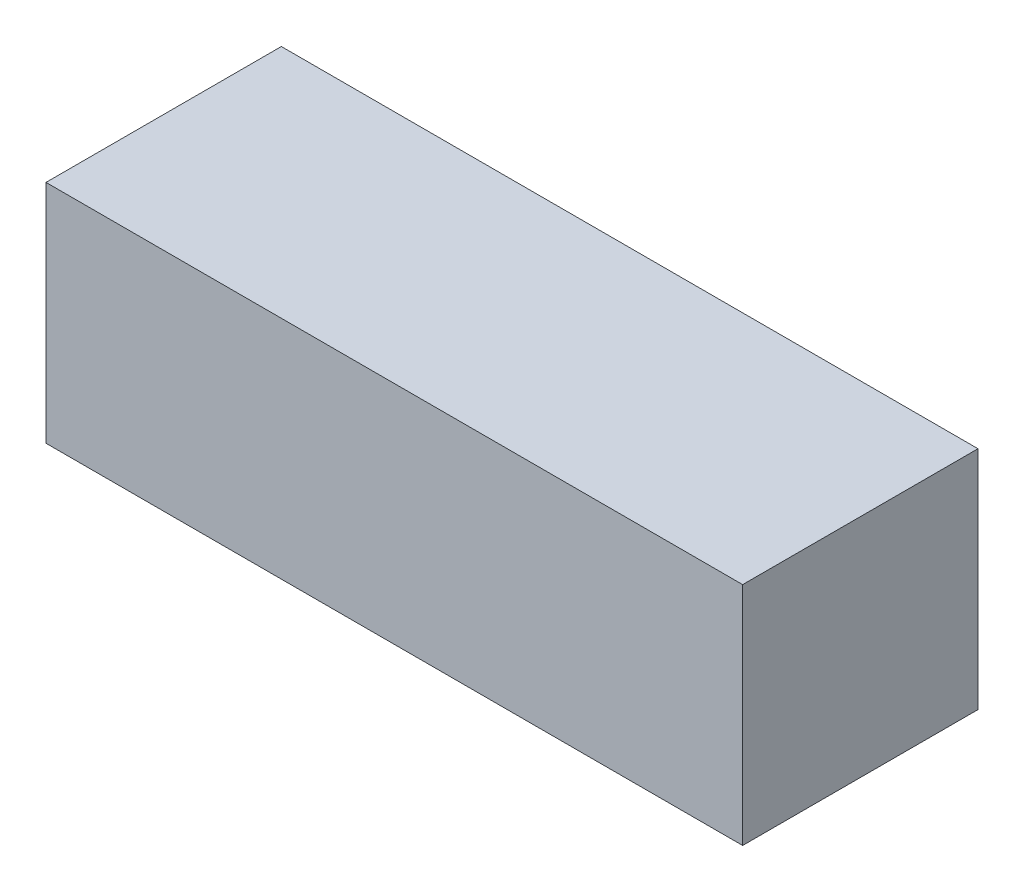
ISO-10303-21;
HEADER;
FILE_DESCRIPTION(('STEP AP214'),'2;1');
FILE_NAME('part.step','',(''),(''),'','','');
FILE_SCHEMA(('AUTOMOTIVE_DESIGN { 1 0 10303 214 1 1 1 1 }'));
ENDSEC;
DATA;
#1=APPLICATION_CONTEXT('core data for automotive mechanical design processes');
#2=APPLICATION_PROTOCOL_DEFINITION('international standard','automotive_design',2000,#1);
#3=PRODUCT_CONTEXT('',#1,'mechanical');
#4=PRODUCT('Part','Part','',(#3));
#5=PRODUCT_RELATED_PRODUCT_CATEGORY('part','',(#4));
#6=PRODUCT_DEFINITION_FORMATION('','',#4);
#7=PRODUCT_DEFINITION_CONTEXT('part definition',#1,'design');
#8=PRODUCT_DEFINITION('design','',#6,#7);
#9=PRODUCT_DEFINITION_SHAPE('','',#8);
#10=(LENGTH_UNIT() NAMED_UNIT(*) SI_UNIT(.MILLI.,.METRE.));
#11=(NAMED_UNIT(*) PLANE_ANGLE_UNIT() SI_UNIT($,.RADIAN.));
#12=(NAMED_UNIT(*) SI_UNIT($,.STERADIAN.) SOLID_ANGLE_UNIT());
#13=UNCERTAINTY_MEASURE_WITH_UNIT(LENGTH_MEASURE(1.E-05),#10,'distance_accuracy_value','');
#14=(GEOMETRIC_REPRESENTATION_CONTEXT(3) GLOBAL_UNCERTAINTY_ASSIGNED_CONTEXT((#13)) GLOBAL_UNIT_ASSIGNED_CONTEXT((#10,
#11,#12)) REPRESENTATION_CONTEXT('',''));
#15=CARTESIAN_POINT('',(0.,0.,0.));
#16=DIRECTION('',(0.,0.,1.));
#17=DIRECTION('',(1.,0.,0.));
#18=AXIS2_PLACEMENT_3D('',#15,#16,#17);
#19=CARTESIAN_POINT('',(-7.40000044,2.40000028,0.));
#20=DIRECTION('',(1.,0.,0.));
#21=DIRECTION('',(0.,-1.,0.));
#22=AXIS2_PLACEMENT_3D('',#19,#20,#21);
#23=PLANE('',#22);
#24=DIRECTION('',(0.,-1.,0.));
#25=VECTOR('',#24,1.);
#26=CARTESIAN_POINT('',(-7.40000044,2.40000028,0.));
#27=LINE('',#26,#25);
#28=CARTESIAN_POINT('',(-7.40000044,2.40000028,0.));
#29=VERTEX_POINT('',#28);
#30=CARTESIAN_POINT('',(-7.40000044,-2.40000028,0.));
#31=VERTEX_POINT('',#30);
#32=EDGE_CURVE('E11',#29,#31,#27,.T.);
#33=ORIENTED_EDGE('',*,*,#32,.T.);
#34=DIRECTION('',(0.,0.,1.));
#35=VECTOR('',#34,1.);
#36=CARTESIAN_POINT('',(-7.40000044,-2.40000028,0.));
#37=LINE('',#36,#35);
#38=CARTESIAN_POINT('',(-7.40000044,-2.40000028,5.00000016));
#39=VERTEX_POINT('',#38);
#40=EDGE_CURVE('E24',#31,#39,#37,.T.);
#41=ORIENTED_EDGE('',*,*,#40,.T.);
#42=DIRECTION('',(0.,-1.,0.));
#43=VECTOR('',#42,1.);
#44=CARTESIAN_POINT('',(-7.40000044,2.40000028,5.00000016));
#45=LINE('',#44,#43);
#46=CARTESIAN_POINT('',(-7.40000044,2.40000028,5.00000016));
#47=VERTEX_POINT('',#46);
#48=EDGE_CURVE('E87',#47,#39,#45,.T.);
#49=ORIENTED_EDGE('',*,*,#48,.F.);
#50=DIRECTION('',(0.,0.,1.));
#51=VECTOR('',#50,1.);
#52=CARTESIAN_POINT('',(-7.40000044,2.40000028,0.));
#53=LINE('',#52,#51);
#54=EDGE_CURVE('E36',#29,#47,#53,.T.);
#55=ORIENTED_EDGE('',*,*,#54,.F.);
#56=EDGE_LOOP('',(#33,#41,#49,#55));
#57=FACE_BOUND('',#56,.T.);
#58=ADVANCED_FACE('F17',(#57),#23,.F.);
#59=CARTESIAN_POINT('',(-7.40000044,-2.40000028,0.));
#60=DIRECTION('',(0.,1.,0.));
#61=DIRECTION('',(1.,0.,0.));
#62=AXIS2_PLACEMENT_3D('',#59,#60,#61);
#63=PLANE('',#62);
#64=DIRECTION('',(1.,0.,0.));
#65=VECTOR('',#64,1.);
#66=CARTESIAN_POINT('',(-7.40000044,-2.40000028,0.));
#67=LINE('',#66,#65);
#68=CARTESIAN_POINT('',(7.40000044,-2.40000028,0.));
#69=VERTEX_POINT('',#68);
#70=EDGE_CURVE('E84',#31,#69,#67,.T.);
#71=ORIENTED_EDGE('',*,*,#70,.T.);
#72=DIRECTION('',(0.,0.,1.));
#73=VECTOR('',#72,1.);
#74=CARTESIAN_POINT('',(7.40000044,-2.40000028,0.));
#75=LINE('',#74,#73);
#76=CARTESIAN_POINT('',(7.40000044,-2.40000028,5.00000016));
#77=VERTEX_POINT('',#76);
#78=EDGE_CURVE('E82',#69,#77,#75,.T.);
#79=ORIENTED_EDGE('',*,*,#78,.T.);
#80=DIRECTION('',(1.,0.,0.));
#81=VECTOR('',#80,1.);
#82=CARTESIAN_POINT('',(-7.40000044,-2.40000028,5.00000016));
#83=LINE('',#82,#81);
#84=EDGE_CURVE('E62',#39,#77,#83,.T.);
#85=ORIENTED_EDGE('',*,*,#84,.F.);
#86=ORIENTED_EDGE('',*,*,#40,.F.);
#87=EDGE_LOOP('',(#71,#79,#85,#86));
#88=FACE_BOUND('',#87,.T.);
#89=ADVANCED_FACE('F89',(#88),#63,.F.);
#90=CARTESIAN_POINT('',(7.40000044,-2.40000028,0.));
#91=DIRECTION('',(-1.,0.,0.));
#92=DIRECTION('',(0.,1.,0.));
#93=AXIS2_PLACEMENT_3D('',#90,#91,#92);
#94=PLANE('',#93);
#95=DIRECTION('',(0.,1.,0.));
#96=VECTOR('',#95,1.);
#97=CARTESIAN_POINT('',(7.40000044,-2.40000028,0.));
#98=LINE('',#97,#96);
#99=CARTESIAN_POINT('',(7.40000044,2.40000028,0.));
#100=VERTEX_POINT('',#99);
#101=EDGE_CURVE('E71',#69,#100,#98,.T.);
#102=ORIENTED_EDGE('',*,*,#101,.T.);
#103=DIRECTION('',(0.,0.,1.));
#104=VECTOR('',#103,1.);
#105=CARTESIAN_POINT('',(7.40000044,2.40000028,0.));
#106=LINE('',#105,#104);
#107=CARTESIAN_POINT('',(7.40000044,2.40000028,5.00000016));
#108=VERTEX_POINT('',#107);
#109=EDGE_CURVE('E65',#100,#108,#106,.T.);
#110=ORIENTED_EDGE('',*,*,#109,.T.);
#111=DIRECTION('',(0.,1.,0.));
#112=VECTOR('',#111,1.);
#113=CARTESIAN_POINT('',(7.40000044,-2.40000028,5.00000016));
#114=LINE('',#113,#112);
#115=EDGE_CURVE('E57',#77,#108,#114,.T.);
#116=ORIENTED_EDGE('',*,*,#115,.F.);
#117=ORIENTED_EDGE('',*,*,#78,.F.);
#118=EDGE_LOOP('',(#102,#110,#116,#117));
#119=FACE_BOUND('',#118,.T.);
#120=ADVANCED_FACE('F69',(#119),#94,.F.);
#121=CARTESIAN_POINT('',(7.40000044,2.40000028,0.));
#122=DIRECTION('',(0.,-1.,0.));
#123=DIRECTION('',(-1.,0.,0.));
#124=AXIS2_PLACEMENT_3D('',#121,#122,#123);
#125=PLANE('',#124);
#126=DIRECTION('',(-1.,0.,0.));
#127=VECTOR('',#126,1.);
#128=CARTESIAN_POINT('',(7.40000044,2.40000028,0.));
#129=LINE('',#128,#127);
#130=EDGE_CURVE('E66',#100,#29,#129,.T.);
#131=ORIENTED_EDGE('',*,*,#130,.T.);
#132=ORIENTED_EDGE('',*,*,#54,.T.);
#133=DIRECTION('',(-1.,0.,0.));
#134=VECTOR('',#133,1.);
#135=CARTESIAN_POINT('',(7.40000044,2.40000028,5.00000016));
#136=LINE('',#135,#134);
#137=EDGE_CURVE('E61',#108,#47,#136,.T.);
#138=ORIENTED_EDGE('',*,*,#137,.F.);
#139=ORIENTED_EDGE('',*,*,#109,.F.);
#140=EDGE_LOOP('',(#131,#132,#138,#139));
#141=FACE_BOUND('',#140,.T.);
#142=ADVANCED_FACE('F76',(#141),#125,.F.);
#143=CARTESIAN_POINT('',(-7.40000044,2.40000028,0.));
#144=DIRECTION('',(0.,0.,-1.));
#145=DIRECTION('',(-1.,0.,0.));
#146=AXIS2_PLACEMENT_3D('',#143,#144,#145);
#147=PLANE('',#146);
#148=ORIENTED_EDGE('',*,*,#130,.F.);
#149=ORIENTED_EDGE('',*,*,#101,.F.);
#150=ORIENTED_EDGE('',*,*,#70,.F.);
#151=ORIENTED_EDGE('',*,*,#32,.F.);
#152=EDGE_LOOP('',(#148,#149,#150,#151));
#153=FACE_BOUND('',#152,.T.);
#154=ADVANCED_FACE('F91',(#153),#147,.T.);
#155=CARTESIAN_POINT('',(-7.40000044,2.40000028,5.00000016));
#156=DIRECTION('',(0.,0.,-1.));
#157=DIRECTION('',(-1.,0.,0.));
#158=AXIS2_PLACEMENT_3D('',#155,#156,#157);
#159=PLANE('',#158);
#160=ORIENTED_EDGE('',*,*,#48,.T.);
#161=ORIENTED_EDGE('',*,*,#84,.T.);
#162=ORIENTED_EDGE('',*,*,#115,.T.);
#163=ORIENTED_EDGE('',*,*,#137,.T.);
#164=EDGE_LOOP('',(#160,#161,#162,#163));
#165=FACE_BOUND('',#164,.T.);
#166=ADVANCED_FACE('F59',(#165),#159,.F.);
#167=CLOSED_SHELL('',(#58,#89,#120,#142,#154,#166));
#168=MANIFOLD_SOLID_BREP('B1',#167);
#169=ADVANCED_BREP_SHAPE_REPRESENTATION('',(#18,#168),#14);
#170=SHAPE_DEFINITION_REPRESENTATION(#9,#169);
ENDSEC;
END-ISO-10303-21;
